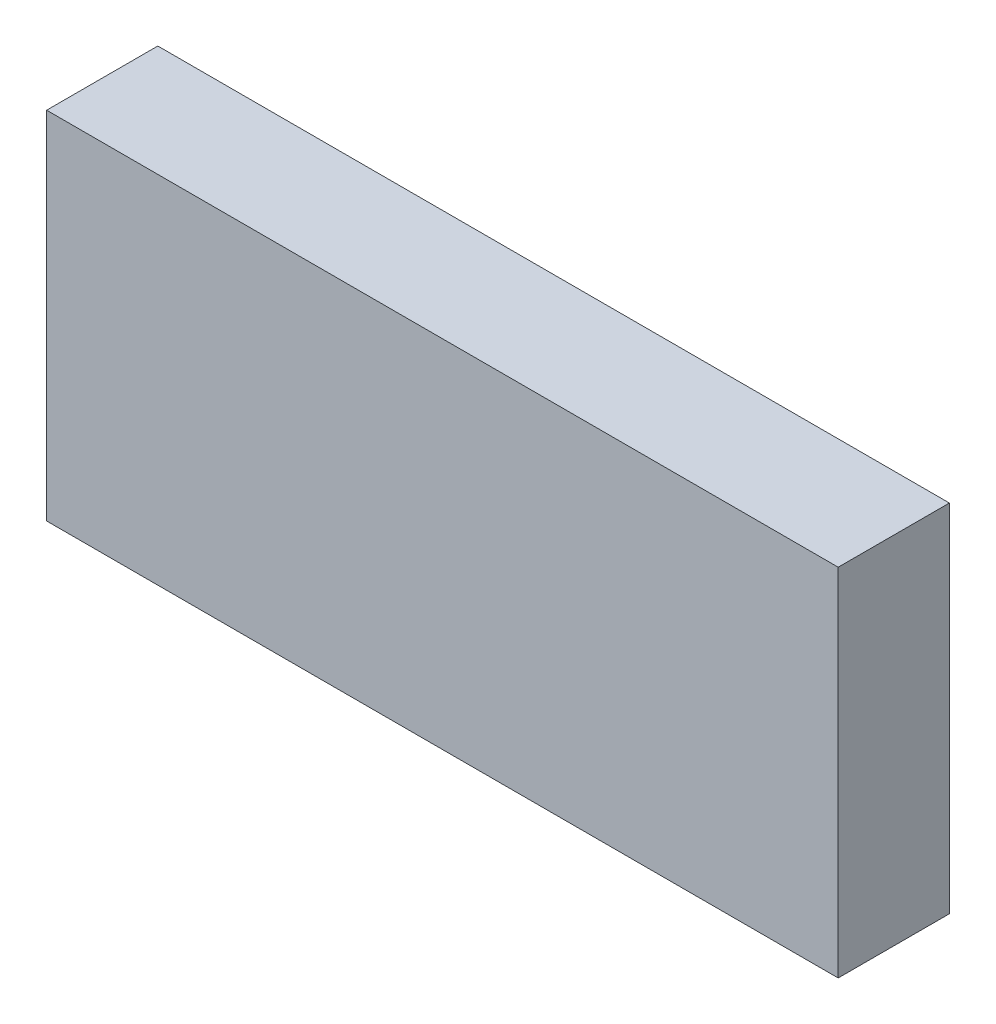
ISO-10303-21;
HEADER;
FILE_DESCRIPTION(('STEP AP214'),'2;1');
FILE_NAME('part.step','',(''),(''),'','','');
FILE_SCHEMA(('AUTOMOTIVE_DESIGN { 1 0 10303 214 1 1 1 1 }'));
ENDSEC;
DATA;
#1=APPLICATION_CONTEXT('core data for automotive mechanical design processes');
#2=APPLICATION_PROTOCOL_DEFINITION('international standard','automotive_design',2000,#1);
#3=PRODUCT_CONTEXT('',#1,'mechanical');
#4=PRODUCT('Part','Part','',(#3));
#5=PRODUCT_RELATED_PRODUCT_CATEGORY('part','',(#4));
#6=PRODUCT_DEFINITION_FORMATION('','',#4);
#7=PRODUCT_DEFINITION_CONTEXT('part definition',#1,'design');
#8=PRODUCT_DEFINITION('design','',#6,#7);
#9=PRODUCT_DEFINITION_SHAPE('','',#8);
#10=(LENGTH_UNIT() NAMED_UNIT(*) SI_UNIT(.MILLI.,.METRE.));
#11=(NAMED_UNIT(*) PLANE_ANGLE_UNIT() SI_UNIT($,.RADIAN.));
#12=(NAMED_UNIT(*) SI_UNIT($,.STERADIAN.) SOLID_ANGLE_UNIT());
#13=UNCERTAINTY_MEASURE_WITH_UNIT(LENGTH_MEASURE(1.E-05),#10,'distance_accuracy_value','');
#14=(GEOMETRIC_REPRESENTATION_CONTEXT(3) GLOBAL_UNCERTAINTY_ASSIGNED_CONTEXT((#13)) GLOBAL_UNIT_ASSIGNED_CONTEXT((#10,
#11,#12)) REPRESENTATION_CONTEXT('',''));
#15=CARTESIAN_POINT('',(0.,0.,0.));
#16=DIRECTION('',(0.,0.,1.));
#17=DIRECTION('',(1.,0.,0.));
#18=AXIS2_PLACEMENT_3D('',#15,#16,#17);
#19=CARTESIAN_POINT('',(-7.04850000000556,-111.950499999997,1.5875));
#20=DIRECTION('',(-1.,0.,0.));
#21=DIRECTION('',(0.,0.,1.));
#22=AXIS2_PLACEMENT_3D('',#19,#20,#21);
#23=PLANE('',#22);
#24=DIRECTION('',(0.,1.,0.));
#25=VECTOR('',#24,1.);
#26=CARTESIAN_POINT('',(-7.04850000000556,-111.950499999997,0.));
#27=LINE('',#26,#25);
#28=CARTESIAN_POINT('',(-7.04850000000556,-111.950499999997,0.));
#29=VERTEX_POINT('',#28);
#30=CARTESIAN_POINT('',(-7.04850000000556,-106.870499999997,0.));
#31=VERTEX_POINT('',#30);
#32=EDGE_CURVE('E96',#29,#31,#27,.T.);
#33=ORIENTED_EDGE('',*,*,#32,.T.);
#34=DIRECTION('',(0.,0.,-1.));
#35=VECTOR('',#34,1.);
#36=CARTESIAN_POINT('',(-7.04850000000556,-106.870499999997,1.5875));
#37=LINE('',#36,#35);
#38=CARTESIAN_POINT('',(-7.04850000000556,-106.870499999997,1.5875));
#39=VERTEX_POINT('',#38);
#40=EDGE_CURVE('E11',#39,#31,#37,.T.);
#41=ORIENTED_EDGE('',*,*,#40,.F.);
#42=DIRECTION('',(0.,1.,0.));
#43=VECTOR('',#42,1.);
#44=CARTESIAN_POINT('',(-7.04850000000556,-111.950499999997,1.5875));
#45=LINE('',#44,#43);
#46=CARTESIAN_POINT('',(-7.04850000000556,-111.950499999997,1.5875));
#47=VERTEX_POINT('',#46);
#48=EDGE_CURVE('E84',#47,#39,#45,.T.);
#49=ORIENTED_EDGE('',*,*,#48,.F.);
#50=DIRECTION('',(0.,0.,-1.));
#51=VECTOR('',#50,1.);
#52=CARTESIAN_POINT('',(-7.04850000000556,-111.950499999997,1.5875));
#53=LINE('',#52,#51);
#54=EDGE_CURVE('E92',#47,#29,#53,.T.);
#55=ORIENTED_EDGE('',*,*,#54,.T.);
#56=EDGE_LOOP('',(#33,#41,#49,#55));
#57=FACE_BOUND('',#56,.T.);
#58=ADVANCED_FACE('F33',(#57),#23,.F.);
#59=CARTESIAN_POINT('',(-7.04850000000556,-106.870499999997,1.5875));
#60=DIRECTION('',(0.,-1.,0.));
#61=DIRECTION('',(0.,0.,-1.));
#62=AXIS2_PLACEMENT_3D('',#59,#60,#61);
#63=PLANE('',#62);
#64=DIRECTION('',(-1.,0.,0.));
#65=VECTOR('',#64,1.);
#66=CARTESIAN_POINT('',(-7.04850000000556,-106.870499999997,0.));
#67=LINE('',#66,#65);
#68=CARTESIAN_POINT('',(-18.3515000000056,-106.870499999997,0.));
#69=VERTEX_POINT('',#68);
#70=EDGE_CURVE('E88',#31,#69,#67,.T.);
#71=ORIENTED_EDGE('',*,*,#70,.T.);
#72=DIRECTION('',(0.,0.,-1.));
#73=VECTOR('',#72,1.);
#74=CARTESIAN_POINT('',(-18.3515000000056,-106.870499999997,1.5875));
#75=LINE('',#74,#73);
#76=CARTESIAN_POINT('',(-18.3515000000056,-106.870499999997,1.5875));
#77=VERTEX_POINT('',#76);
#78=EDGE_CURVE('E41',#77,#69,#75,.T.);
#79=ORIENTED_EDGE('',*,*,#78,.F.);
#80=DIRECTION('',(-1.,0.,0.));
#81=VECTOR('',#80,1.);
#82=CARTESIAN_POINT('',(-7.04850000000556,-106.870499999997,1.5875));
#83=LINE('',#82,#81);
#84=EDGE_CURVE('E79',#39,#77,#83,.T.);
#85=ORIENTED_EDGE('',*,*,#84,.F.);
#86=ORIENTED_EDGE('',*,*,#40,.T.);
#87=EDGE_LOOP('',(#71,#79,#85,#86));
#88=FACE_BOUND('',#87,.T.);
#89=ADVANCED_FACE('F87',(#88),#63,.F.);
#90=CARTESIAN_POINT('',(-18.3515000000056,-111.950499999997,1.5875));
#91=DIRECTION('',(1.,0.,0.));
#92=DIRECTION('',(0.,0.,-1.));
#93=AXIS2_PLACEMENT_3D('',#90,#91,#92);
#94=PLANE('',#93);
#95=DIRECTION('',(0.,-1.,0.));
#96=VECTOR('',#95,1.);
#97=CARTESIAN_POINT('',(-18.3515000000056,-111.950499999997,0.));
#98=LINE('',#97,#96);
#99=CARTESIAN_POINT('',(-18.3515000000056,-111.950499999997,0.));
#100=VERTEX_POINT('',#99);
#101=EDGE_CURVE('E66',#69,#100,#98,.T.);
#102=ORIENTED_EDGE('',*,*,#101,.T.);
#103=DIRECTION('',(0.,0.,-1.));
#104=VECTOR('',#103,1.);
#105=CARTESIAN_POINT('',(-18.3515000000056,-111.950499999997,1.5875));
#106=LINE('',#105,#104);
#107=CARTESIAN_POINT('',(-18.3515000000056,-111.950499999997,1.5875));
#108=VERTEX_POINT('',#107);
#109=EDGE_CURVE('E89',#108,#100,#106,.T.);
#110=ORIENTED_EDGE('',*,*,#109,.F.);
#111=DIRECTION('',(0.,-1.,0.));
#112=VECTOR('',#111,1.);
#113=CARTESIAN_POINT('',(-18.3515000000056,-111.950499999997,1.5875));
#114=LINE('',#113,#112);
#115=EDGE_CURVE('E82',#77,#108,#114,.T.);
#116=ORIENTED_EDGE('',*,*,#115,.F.);
#117=ORIENTED_EDGE('',*,*,#78,.T.);
#118=EDGE_LOOP('',(#102,#110,#116,#117));
#119=FACE_BOUND('',#118,.T.);
#120=ADVANCED_FACE('F90',(#119),#94,.F.);
#121=CARTESIAN_POINT('',(-7.04850000000556,-111.950499999997,1.5875));
#122=DIRECTION('',(0.,1.,0.));
#123=DIRECTION('',(0.,0.,1.));
#124=AXIS2_PLACEMENT_3D('',#121,#122,#123);
#125=PLANE('',#124);
#126=DIRECTION('',(1.,0.,0.));
#127=VECTOR('',#126,1.);
#128=CARTESIAN_POINT('',(-7.04850000000556,-111.950499999997,0.));
#129=LINE('',#128,#127);
#130=EDGE_CURVE('E72',#100,#29,#129,.T.);
#131=ORIENTED_EDGE('',*,*,#130,.T.);
#132=ORIENTED_EDGE('',*,*,#54,.F.);
#133=DIRECTION('',(1.,0.,0.));
#134=VECTOR('',#133,1.);
#135=CARTESIAN_POINT('',(-7.04850000000556,-111.950499999997,1.5875));
#136=LINE('',#135,#134);
#137=EDGE_CURVE('E49',#108,#47,#136,.T.);
#138=ORIENTED_EDGE('',*,*,#137,.F.);
#139=ORIENTED_EDGE('',*,*,#109,.T.);
#140=EDGE_LOOP('',(#131,#132,#138,#139));
#141=FACE_BOUND('',#140,.T.);
#142=ADVANCED_FACE('F103',(#141),#125,.F.);
#143=CARTESIAN_POINT('',(0.,0.,1.5875));
#144=DIRECTION('',(0.,0.,1.));
#145=DIRECTION('',(1.,0.,0.));
#146=AXIS2_PLACEMENT_3D('',#143,#144,#145);
#147=PLANE('',#146);
#148=ORIENTED_EDGE('',*,*,#48,.T.);
#149=ORIENTED_EDGE('',*,*,#84,.T.);
#150=ORIENTED_EDGE('',*,*,#115,.T.);
#151=ORIENTED_EDGE('',*,*,#137,.T.);
#152=EDGE_LOOP('',(#148,#149,#150,#151));
#153=FACE_BOUND('',#152,.T.);
#154=ADVANCED_FACE('F80',(#153),#147,.T.);
#155=CARTESIAN_POINT('',(0.,0.,0.));
#156=DIRECTION('',(0.,0.,1.));
#157=DIRECTION('',(1.,0.,0.));
#158=AXIS2_PLACEMENT_3D('',#155,#156,#157);
#159=PLANE('',#158);
#160=ORIENTED_EDGE('',*,*,#32,.F.);
#161=ORIENTED_EDGE('',*,*,#130,.F.);
#162=ORIENTED_EDGE('',*,*,#101,.F.);
#163=ORIENTED_EDGE('',*,*,#70,.F.);
#164=EDGE_LOOP('',(#160,#161,#162,#163));
#165=FACE_BOUND('',#164,.T.);
#166=ADVANCED_FACE('F106',(#165),#159,.F.);
#167=CLOSED_SHELL('',(#58,#89,#120,#142,#154,#166));
#168=MANIFOLD_SOLID_BREP('B2',#167);
#169=ADVANCED_BREP_SHAPE_REPRESENTATION('',(#18,#168),#14);
#170=SHAPE_DEFINITION_REPRESENTATION(#9,#169);
ENDSEC;
END-ISO-10303-21;
